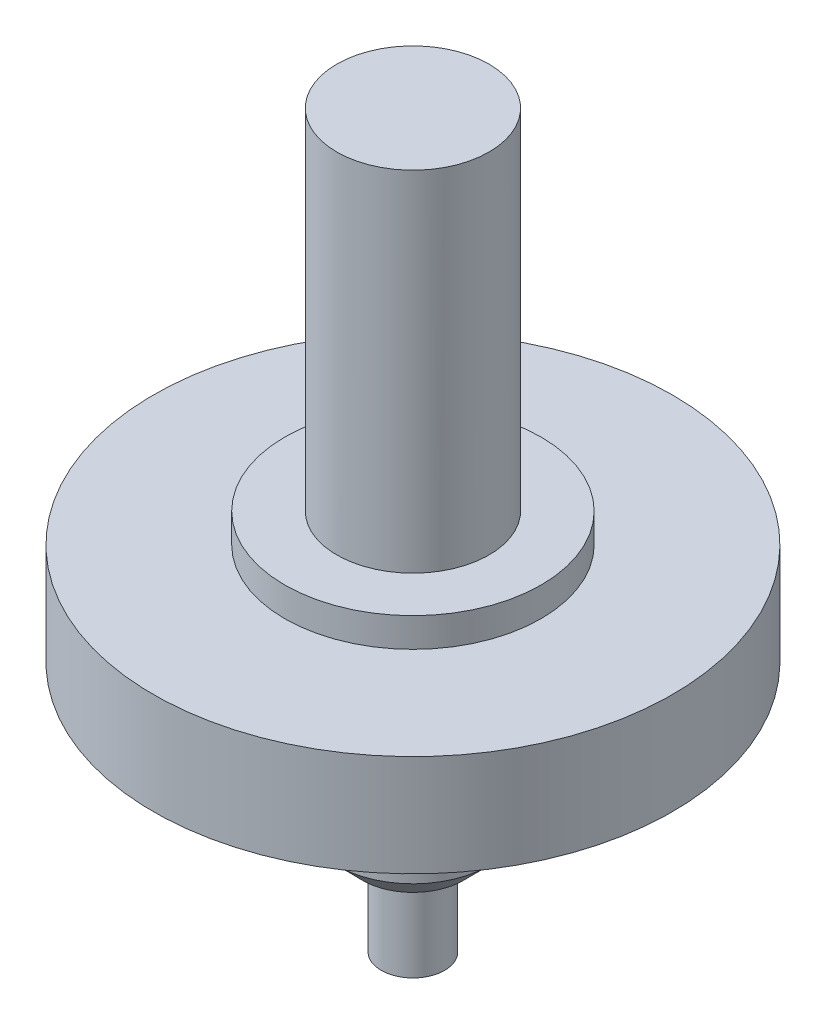
ISO-10303-21;
HEADER;
FILE_DESCRIPTION(('STEP AP214'),'2;1');
FILE_NAME('part.step','',(''),(''),'','','');
FILE_SCHEMA(('AUTOMOTIVE_DESIGN { 1 0 10303 214 1 1 1 1 }'));
ENDSEC;
DATA;
#1=APPLICATION_CONTEXT('core data for automotive mechanical design processes');
#2=APPLICATION_PROTOCOL_DEFINITION('international standard','automotive_design',2000,#1);
#3=PRODUCT_CONTEXT('',#1,'mechanical');
#4=PRODUCT('Part','Part','',(#3));
#5=PRODUCT_RELATED_PRODUCT_CATEGORY('part','',(#4));
#6=PRODUCT_DEFINITION_FORMATION('','',#4);
#7=PRODUCT_DEFINITION_CONTEXT('part definition',#1,'design');
#8=PRODUCT_DEFINITION('design','',#6,#7);
#9=PRODUCT_DEFINITION_SHAPE('','',#8);
#10=(LENGTH_UNIT() NAMED_UNIT(*) SI_UNIT(.MILLI.,.METRE.));
#11=(NAMED_UNIT(*) PLANE_ANGLE_UNIT() SI_UNIT($,.RADIAN.));
#12=(NAMED_UNIT(*) SI_UNIT($,.STERADIAN.) SOLID_ANGLE_UNIT());
#13=UNCERTAINTY_MEASURE_WITH_UNIT(LENGTH_MEASURE(1.E-05),#10,'distance_accuracy_value','');
#14=(GEOMETRIC_REPRESENTATION_CONTEXT(3) GLOBAL_UNCERTAINTY_ASSIGNED_CONTEXT((#13)) GLOBAL_UNIT_ASSIGNED_CONTEXT((#10,
#11,#12)) REPRESENTATION_CONTEXT('',''));
#15=CARTESIAN_POINT('',(0.,0.,0.));
#16=DIRECTION('',(0.,0.,1.));
#17=DIRECTION('',(1.,0.,0.));
#18=AXIS2_PLACEMENT_3D('',#15,#16,#17);
#19=CARTESIAN_POINT('',(0.,0.,0.));
#20=DIRECTION('',(0.,-1.,0.));
#21=DIRECTION('',(0.,0.,-1.));
#22=AXIS2_PLACEMENT_3D('',#19,#20,#21);
#23=CYLINDRICAL_SURFACE('',#22,3.);
#24=CARTESIAN_POINT('',(0.,15.05,0.));
#25=DIRECTION('',(0.,-1.,0.));
#26=DIRECTION('',(0.,0.,-1.));
#27=AXIS2_PLACEMENT_3D('',#24,#25,#26);
#28=CIRCLE('',#27,3.);
#29=CARTESIAN_POINT('',(0.,15.05,-3.));
#30=VERTEX_POINT('',#29);
#31=EDGE_CURVE('E10',#30,#30,#28,.T.);
#32=ORIENTED_EDGE('',*,*,#31,.F.);
#33=EDGE_LOOP('',(#32));
#34=FACE_BOUND('',#33,.T.);
#35=CARTESIAN_POINT('',(0.,28.8,0.));
#36=DIRECTION('',(0.,1.,0.));
#37=DIRECTION('',(0.,0.,1.));
#38=AXIS2_PLACEMENT_3D('',#35,#36,#37);
#39=CIRCLE('',#38,3.);
#40=CARTESIAN_POINT('',(0.,28.8,3.));
#41=VERTEX_POINT('',#40);
#42=EDGE_CURVE('E71',#41,#41,#39,.T.);
#43=ORIENTED_EDGE('',*,*,#42,.F.);
#44=EDGE_LOOP('',(#43));
#45=FACE_BOUND('',#44,.T.);
#46=ADVANCED_FACE('F33',(#34,#45),#23,.T.);
#47=CARTESIAN_POINT('',(1.25,0.,0.));
#48=DIRECTION('',(0.,-1.,0.));
#49=DIRECTION('',(0.,0.,-1.));
#50=AXIS2_PLACEMENT_3D('',#47,#48,#49);
#51=PLANE('',#50);
#52=CARTESIAN_POINT('',(0.,0.,0.));
#53=DIRECTION('',(0.,-1.,0.));
#54=DIRECTION('',(0.,0.,-1.));
#55=AXIS2_PLACEMENT_3D('',#52,#53,#54);
#56=CIRCLE('',#55,1.25);
#57=CARTESIAN_POINT('',(0.,0.,-1.25));
#58=VERTEX_POINT('',#57);
#59=EDGE_CURVE('E68',#58,#58,#56,.T.);
#60=ORIENTED_EDGE('',*,*,#59,.T.);
#61=EDGE_LOOP('',(#60));
#62=FACE_BOUND('',#61,.T.);
#63=ADVANCED_FACE('F35',(#62),#51,.T.);
#64=CARTESIAN_POINT('',(3.,15.05,0.));
#65=DIRECTION('',(0.,1.,0.));
#66=DIRECTION('',(0.,0.,1.));
#67=AXIS2_PLACEMENT_3D('',#64,#65,#66);
#68=PLANE('',#67);
#69=ORIENTED_EDGE('',*,*,#31,.T.);
#70=EDGE_LOOP('',(#69));
#71=FACE_BOUND('',#70,.T.);
#72=CARTESIAN_POINT('',(0.,15.05,0.));
#73=DIRECTION('',(0.,-1.,0.));
#74=DIRECTION('',(0.,0.,-1.));
#75=AXIS2_PLACEMENT_3D('',#72,#73,#74);
#76=CIRCLE('',#75,5.05);
#77=CARTESIAN_POINT('',(0.,15.05,-5.05));
#78=VERTEX_POINT('',#77);
#79=EDGE_CURVE('E40',#78,#78,#76,.T.);
#80=ORIENTED_EDGE('',*,*,#79,.F.);
#81=EDGE_LOOP('',(#80));
#82=FACE_BOUND('',#81,.T.);
#83=ADVANCED_FACE('F83',(#71,#82),#68,.T.);
#84=CARTESIAN_POINT('',(0.,0.,0.));
#85=DIRECTION('',(0.,-1.,0.));
#86=DIRECTION('',(0.,0.,-1.));
#87=AXIS2_PLACEMENT_3D('',#84,#85,#86);
#88=CYLINDRICAL_SURFACE('',#87,5.05);
#89=ORIENTED_EDGE('',*,*,#79,.T.);
#90=EDGE_LOOP('',(#89));
#91=FACE_BOUND('',#90,.T.);
#92=CARTESIAN_POINT('',(0.,13.9,0.));
#93=DIRECTION('',(0.,-1.,0.));
#94=DIRECTION('',(0.,0.,-1.));
#95=AXIS2_PLACEMENT_3D('',#92,#93,#94);
#96=CIRCLE('',#95,5.05);
#97=CARTESIAN_POINT('',(0.,13.9,-5.05));
#98=VERTEX_POINT('',#97);
#99=EDGE_CURVE('E44',#98,#98,#96,.T.);
#100=ORIENTED_EDGE('',*,*,#99,.F.);
#101=EDGE_LOOP('',(#100));
#102=FACE_BOUND('',#101,.T.);
#103=ADVANCED_FACE('F88',(#91,#102),#88,.T.);
#104=CARTESIAN_POINT('',(5.05,13.9,0.));
#105=DIRECTION('',(0.,1.,0.));
#106=DIRECTION('',(0.,0.,1.));
#107=AXIS2_PLACEMENT_3D('',#104,#105,#106);
#108=PLANE('',#107);
#109=ORIENTED_EDGE('',*,*,#99,.T.);
#110=EDGE_LOOP('',(#109));
#111=FACE_BOUND('',#110,.T.);
#112=CARTESIAN_POINT('',(0.,13.9,0.));
#113=DIRECTION('',(0.,-1.,0.));
#114=DIRECTION('',(0.,0.,-1.));
#115=AXIS2_PLACEMENT_3D('',#112,#113,#114);
#116=CIRCLE('',#115,10.225);
#117=CARTESIAN_POINT('',(0.,13.9,-10.225));
#118=VERTEX_POINT('',#117);
#119=EDGE_CURVE('E48',#118,#118,#116,.T.);
#120=ORIENTED_EDGE('',*,*,#119,.F.);
#121=EDGE_LOOP('',(#120));
#122=FACE_BOUND('',#121,.T.);
#123=ADVANCED_FACE('F91',(#111,#122),#108,.T.);
#124=CARTESIAN_POINT('',(0.,0.,0.));
#125=DIRECTION('',(0.,-1.,0.));
#126=DIRECTION('',(0.,0.,-1.));
#127=AXIS2_PLACEMENT_3D('',#124,#125,#126);
#128=CYLINDRICAL_SURFACE('',#127,10.225);
#129=ORIENTED_EDGE('',*,*,#119,.T.);
#130=EDGE_LOOP('',(#129));
#131=FACE_BOUND('',#130,.T.);
#132=CARTESIAN_POINT('',(0.,9.90000000000001,0.));
#133=DIRECTION('',(0.,-1.,0.));
#134=DIRECTION('',(0.,0.,-1.));
#135=AXIS2_PLACEMENT_3D('',#132,#133,#134);
#136=CIRCLE('',#135,10.225);
#137=CARTESIAN_POINT('',(0.,9.90000000000001,-10.225));
#138=VERTEX_POINT('',#137);
#139=EDGE_CURVE('E53',#138,#138,#136,.T.);
#140=ORIENTED_EDGE('',*,*,#139,.F.);
#141=EDGE_LOOP('',(#140));
#142=FACE_BOUND('',#141,.T.);
#143=ADVANCED_FACE('F94',(#131,#142),#128,.T.);
#144=CARTESIAN_POINT('',(10.225,9.90000000000001,0.));
#145=DIRECTION('',(0.,-1.,0.));
#146=DIRECTION('',(0.,0.,-1.));
#147=AXIS2_PLACEMENT_3D('',#144,#145,#146);
#148=PLANE('',#147);
#149=ORIENTED_EDGE('',*,*,#139,.T.);
#150=EDGE_LOOP('',(#149));
#151=FACE_BOUND('',#150,.T.);
#152=CARTESIAN_POINT('',(0.,9.9,0.));
#153=DIRECTION('',(0.,-1.,0.));
#154=DIRECTION('',(0.,0.,-1.));
#155=AXIS2_PLACEMENT_3D('',#152,#153,#154);
#156=CIRCLE('',#155,3.);
#157=CARTESIAN_POINT('',(0.,9.9,-3.));
#158=VERTEX_POINT('',#157);
#159=EDGE_CURVE('E56',#158,#158,#156,.T.);
#160=ORIENTED_EDGE('',*,*,#159,.F.);
#161=EDGE_LOOP('',(#160));
#162=FACE_BOUND('',#161,.T.);
#163=ADVANCED_FACE('F98',(#151,#162),#148,.T.);
#164=CARTESIAN_POINT('',(0.,0.,0.));
#165=DIRECTION('',(0.,-1.,0.));
#166=DIRECTION('',(0.,0.,-1.));
#167=AXIS2_PLACEMENT_3D('',#164,#165,#166);
#168=CYLINDRICAL_SURFACE('',#167,3.00000000000001);
#169=ORIENTED_EDGE('',*,*,#159,.T.);
#170=EDGE_LOOP('',(#169));
#171=FACE_BOUND('',#170,.T.);
#172=CARTESIAN_POINT('',(0.,4.45,0.));
#173=DIRECTION('',(0.,-1.,0.));
#174=DIRECTION('',(0.,0.,-1.));
#175=AXIS2_PLACEMENT_3D('',#172,#173,#174);
#176=CIRCLE('',#175,3.00000000000001);
#177=CARTESIAN_POINT('',(0.,4.45,-3.00000000000001));
#178=VERTEX_POINT('',#177);
#179=EDGE_CURVE('E59',#178,#178,#176,.T.);
#180=ORIENTED_EDGE('',*,*,#179,.F.);
#181=EDGE_LOOP('',(#180));
#182=FACE_BOUND('',#181,.T.);
#183=ADVANCED_FACE('F102',(#171,#182),#168,.T.);
#184=CARTESIAN_POINT('',(0.,3.45,0.));
#185=DIRECTION('',(0.,1.,0.));
#186=DIRECTION('',(0.,0.,1.));
#187=AXIS2_PLACEMENT_3D('',#184,#185,#186);
#188=CONICAL_SURFACE('',#187,2.00000000000001,0.785398163397448);
#189=ORIENTED_EDGE('',*,*,#179,.T.);
#190=EDGE_LOOP('',(#189));
#191=FACE_BOUND('',#190,.T.);
#192=CARTESIAN_POINT('',(0.,3.45,0.));
#193=DIRECTION('',(0.,-1.,0.));
#194=DIRECTION('',(0.,0.,-1.));
#195=AXIS2_PLACEMENT_3D('',#192,#193,#194);
#196=CIRCLE('',#195,2.00000000000001);
#197=CARTESIAN_POINT('',(0.,3.45,-2.00000000000001));
#198=VERTEX_POINT('',#197);
#199=EDGE_CURVE('E62',#198,#198,#196,.T.);
#200=ORIENTED_EDGE('',*,*,#199,.F.);
#201=EDGE_LOOP('',(#200));
#202=FACE_BOUND('',#201,.T.);
#203=ADVANCED_FACE('F106',(#191,#202),#188,.T.);
#204=CARTESIAN_POINT('',(2.00000000000001,3.45,0.));
#205=DIRECTION('',(0.,-1.,0.));
#206=DIRECTION('',(0.,0.,-1.));
#207=AXIS2_PLACEMENT_3D('',#204,#205,#206);
#208=PLANE('',#207);
#209=ORIENTED_EDGE('',*,*,#199,.T.);
#210=EDGE_LOOP('',(#209));
#211=FACE_BOUND('',#210,.T.);
#212=CARTESIAN_POINT('',(0.,3.45,0.));
#213=DIRECTION('',(0.,-1.,0.));
#214=DIRECTION('',(0.,0.,-1.));
#215=AXIS2_PLACEMENT_3D('',#212,#213,#214);
#216=CIRCLE('',#215,1.25);
#217=CARTESIAN_POINT('',(0.,3.45,-1.25));
#218=VERTEX_POINT('',#217);
#219=EDGE_CURVE('E65',#218,#218,#216,.T.);
#220=ORIENTED_EDGE('',*,*,#219,.F.);
#221=EDGE_LOOP('',(#220));
#222=FACE_BOUND('',#221,.T.);
#223=ADVANCED_FACE('F110',(#211,#222),#208,.T.);
#224=CARTESIAN_POINT('',(0.,0.,0.));
#225=DIRECTION('',(0.,-1.,0.));
#226=DIRECTION('',(0.,0.,-1.));
#227=AXIS2_PLACEMENT_3D('',#224,#225,#226);
#228=CYLINDRICAL_SURFACE('',#227,1.25);
#229=ORIENTED_EDGE('',*,*,#219,.T.);
#230=EDGE_LOOP('',(#229));
#231=FACE_BOUND('',#230,.T.);
#232=ORIENTED_EDGE('',*,*,#59,.F.);
#233=EDGE_LOOP('',(#232));
#234=FACE_BOUND('',#233,.T.);
#235=ADVANCED_FACE('F114',(#231,#234),#228,.T.);
#236=CARTESIAN_POINT('',(0.,28.8,0.));
#237=DIRECTION('',(0.,1.,0.));
#238=DIRECTION('',(0.,0.,1.));
#239=AXIS2_PLACEMENT_3D('',#236,#237,#238);
#240=PLANE('',#239);
#241=ORIENTED_EDGE('',*,*,#42,.T.);
#242=EDGE_LOOP('',(#241));
#243=FACE_BOUND('',#242,.T.);
#244=ADVANCED_FACE('F75',(#243),#240,.T.);
#245=CLOSED_SHELL('',(#46,#63,#83,#103,#123,#143,#163,#183,#203,#223,#235,#244));
#246=MANIFOLD_SOLID_BREP('B2',#245);
#247=ADVANCED_BREP_SHAPE_REPRESENTATION('',(#18,#246),#14);
#248=SHAPE_DEFINITION_REPRESENTATION(#9,#247);
ENDSEC;
END-ISO-10303-21;
